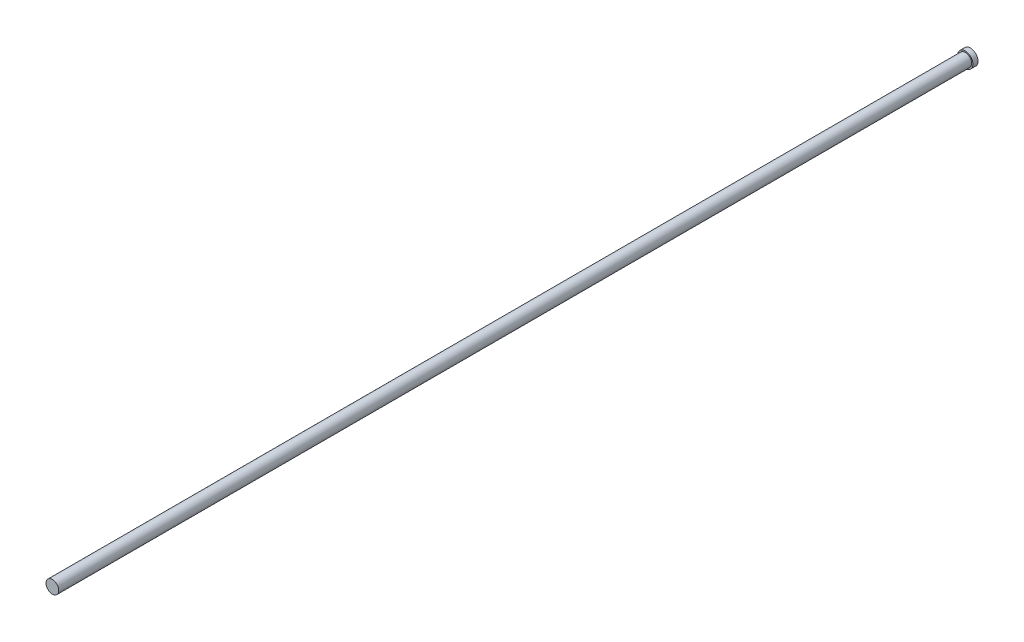
ISO-10303-21;
HEADER;
FILE_DESCRIPTION(('STEP AP214'),'2;1');
FILE_NAME('part.step','',(''),(''),'','','');
FILE_SCHEMA(('AUTOMOTIVE_DESIGN { 1 0 10303 214 1 1 1 1 }'));
ENDSEC;
DATA;
#1=APPLICATION_CONTEXT('core data for automotive mechanical design processes');
#2=APPLICATION_PROTOCOL_DEFINITION('international standard','automotive_design',2000,#1);
#3=PRODUCT_CONTEXT('',#1,'mechanical');
#4=PRODUCT('Part','Part','',(#3));
#5=PRODUCT_RELATED_PRODUCT_CATEGORY('part','',(#4));
#6=PRODUCT_DEFINITION_FORMATION('','',#4);
#7=PRODUCT_DEFINITION_CONTEXT('part definition',#1,'design');
#8=PRODUCT_DEFINITION('design','',#6,#7);
#9=PRODUCT_DEFINITION_SHAPE('','',#8);
#10=(LENGTH_UNIT() NAMED_UNIT(*) SI_UNIT(.MILLI.,.METRE.));
#11=(NAMED_UNIT(*) PLANE_ANGLE_UNIT() SI_UNIT($,.RADIAN.));
#12=(NAMED_UNIT(*) SI_UNIT($,.STERADIAN.) SOLID_ANGLE_UNIT());
#13=UNCERTAINTY_MEASURE_WITH_UNIT(LENGTH_MEASURE(1.E-05),#10,'distance_accuracy_value','');
#14=(GEOMETRIC_REPRESENTATION_CONTEXT(3) GLOBAL_UNCERTAINTY_ASSIGNED_CONTEXT((#13)) GLOBAL_UNIT_ASSIGNED_CONTEXT((#10,
#11,#12)) REPRESENTATION_CONTEXT('',''));
#15=CARTESIAN_POINT('',(0.,0.,0.));
#16=DIRECTION('',(0.,0.,1.));
#17=DIRECTION('',(1.,0.,0.));
#18=AXIS2_PLACEMENT_3D('',#15,#16,#17);
#19=CARTESIAN_POINT('',(-13.0869031863445,5.5491891992404,358.39));
#20=DIRECTION('',(0.,0.,-1.));
#21=DIRECTION('',(-1.,0.,0.));
#22=AXIS2_PLACEMENT_3D('',#19,#20,#21);
#23=CYLINDRICAL_SURFACE('',#22,2.5);
#24=CARTESIAN_POINT('',(-13.0869031863445,5.5491891992404,358.39));
#25=DIRECTION('',(0.,0.,1.));
#26=DIRECTION('',(1.,0.,0.));
#27=AXIS2_PLACEMENT_3D('',#24,#25,#26);
#28=CIRCLE('',#27,2.5);
#29=CARTESIAN_POINT('',(-10.5869031863445,5.5491891992404,358.39));
#30=VERTEX_POINT('',#29);
#31=EDGE_CURVE('E10',#30,#30,#28,.T.);
#32=ORIENTED_EDGE('',*,*,#31,.F.);
#33=EDGE_LOOP('',(#32));
#34=FACE_BOUND('',#33,.T.);
#35=CARTESIAN_POINT('',(-13.0869031863445,5.5491891992404,0.));
#36=DIRECTION('',(0.,0.,1.));
#37=DIRECTION('',(1.,0.,0.));
#38=AXIS2_PLACEMENT_3D('',#35,#36,#37);
#39=CIRCLE('',#38,2.5);
#40=CARTESIAN_POINT('',(-10.5869031863445,5.5491891992404,0.));
#41=VERTEX_POINT('',#40);
#42=EDGE_CURVE('E42',#41,#41,#39,.T.);
#43=ORIENTED_EDGE('',*,*,#42,.T.);
#44=EDGE_LOOP('',(#43));
#45=FACE_BOUND('',#44,.T.);
#46=ADVANCED_FACE('F39',(#34,#45),#23,.T.);
#47=CARTESIAN_POINT('',(-13.0869031863445,5.5491891992404,358.39));
#48=DIRECTION('',(0.,0.,1.));
#49=DIRECTION('',(1.,0.,0.));
#50=AXIS2_PLACEMENT_3D('',#47,#48,#49);
#51=PLANE('',#50);
#52=ORIENTED_EDGE('',*,*,#31,.T.);
#53=EDGE_LOOP('',(#52));
#54=FACE_BOUND('',#53,.T.);
#55=ADVANCED_FACE('F74',(#54),#51,.T.);
#56=CARTESIAN_POINT('',(-13.0879320388451,5.56843037677855,-2.));
#57=DIRECTION('',(0.,0.,1.));
#58=DIRECTION('',(1.,0.,0.));
#59=AXIS2_PLACEMENT_3D('',#56,#57,#58);
#60=CYLINDRICAL_SURFACE('',#59,3.);
#61=CARTESIAN_POINT('',(-13.0879320388451,5.56843037677855,-2.));
#62=DIRECTION('',(0.,0.,1.));
#63=DIRECTION('',(1.,0.,0.));
#64=AXIS2_PLACEMENT_3D('',#61,#62,#63);
#65=CIRCLE('',#64,3.);
#66=CARTESIAN_POINT('',(-10.0879320388451,5.56843037677855,-2.));
#67=VERTEX_POINT('',#66);
#68=EDGE_CURVE('E51',#67,#67,#65,.T.);
#69=ORIENTED_EDGE('',*,*,#68,.T.);
#70=EDGE_LOOP('',(#69));
#71=FACE_BOUND('',#70,.T.);
#72=CARTESIAN_POINT('',(-13.0879320388451,5.56843037677855,0.));
#73=DIRECTION('',(0.,0.,1.));
#74=DIRECTION('',(1.,0.,0.));
#75=AXIS2_PLACEMENT_3D('',#72,#73,#74);
#76=CIRCLE('',#75,3.);
#77=CARTESIAN_POINT('',(-10.0879320388451,5.56843037677855,0.));
#78=VERTEX_POINT('',#77);
#79=EDGE_CURVE('E53',#78,#78,#76,.T.);
#80=ORIENTED_EDGE('',*,*,#79,.F.);
#81=EDGE_LOOP('',(#80));
#82=FACE_BOUND('',#81,.T.);
#83=ADVANCED_FACE('F61',(#71,#82),#60,.T.);
#84=CARTESIAN_POINT('',(-13.0879320388451,5.56843037677855,-2.));
#85=DIRECTION('',(0.,0.,1.));
#86=DIRECTION('',(1.,0.,0.));
#87=AXIS2_PLACEMENT_3D('',#84,#85,#86);
#88=PLANE('',#87);
#89=ORIENTED_EDGE('',*,*,#68,.F.);
#90=EDGE_LOOP('',(#89));
#91=FACE_BOUND('',#90,.T.);
#92=ADVANCED_FACE('F64',(#91),#88,.F.);
#93=CARTESIAN_POINT('',(-13.0879320388451,5.56843037677855,0.));
#94=DIRECTION('',(0.,0.,1.));
#95=DIRECTION('',(1.,0.,0.));
#96=AXIS2_PLACEMENT_3D('',#93,#94,#95);
#97=PLANE('',#96);
#98=ORIENTED_EDGE('',*,*,#42,.F.);
#99=EDGE_LOOP('',(#98));
#100=FACE_BOUND('',#99,.T.);
#101=ORIENTED_EDGE('',*,*,#79,.T.);
#102=EDGE_LOOP('',(#101));
#103=FACE_BOUND('',#102,.T.);
#104=ADVANCED_FACE('F66',(#100,#103),#97,.T.);
#105=CLOSED_SHELL('',(#46,#55,#83,#92,#104));
#106=MANIFOLD_SOLID_BREP('B2',#105);
#107=ADVANCED_BREP_SHAPE_REPRESENTATION('',(#18,#106),#14);
#108=SHAPE_DEFINITION_REPRESENTATION(#9,#107);
ENDSEC;
END-ISO-10303-21;
